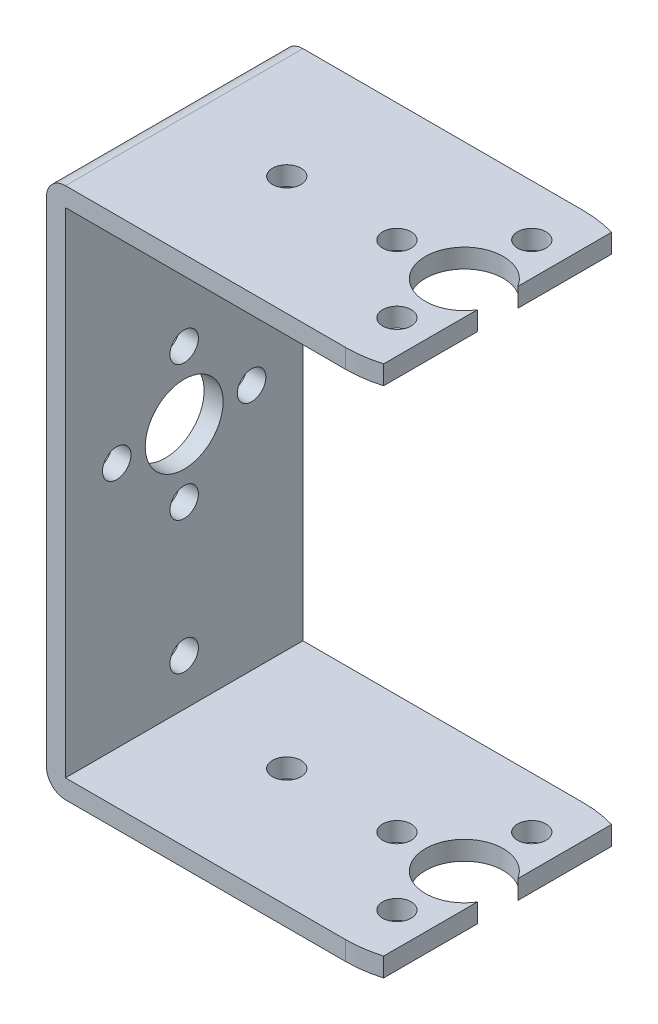
ISO-10303-21;
HEADER;
FILE_DESCRIPTION(('STEP AP214'),'2;1');
FILE_NAME('part.step','',(''),(''),'','','');
FILE_SCHEMA(('AUTOMOTIVE_DESIGN { 1 0 10303 214 1 1 1 1 }'));
ENDSEC;
DATA;
#1=APPLICATION_CONTEXT('core data for automotive mechanical design processes');
#2=APPLICATION_PROTOCOL_DEFINITION('international standard','automotive_design',2000,#1);
#3=PRODUCT_CONTEXT('',#1,'mechanical');
#4=PRODUCT('Part','Part','',(#3));
#5=PRODUCT_RELATED_PRODUCT_CATEGORY('part','',(#4));
#6=PRODUCT_DEFINITION_FORMATION('','',#4);
#7=PRODUCT_DEFINITION_CONTEXT('part definition',#1,'design');
#8=PRODUCT_DEFINITION('design','',#6,#7);
#9=PRODUCT_DEFINITION_SHAPE('','',#8);
#10=(LENGTH_UNIT() NAMED_UNIT(*) SI_UNIT(.MILLI.,.METRE.));
#11=(NAMED_UNIT(*) PLANE_ANGLE_UNIT() SI_UNIT($,.RADIAN.));
#12=(NAMED_UNIT(*) SI_UNIT($,.STERADIAN.) SOLID_ANGLE_UNIT());
#13=UNCERTAINTY_MEASURE_WITH_UNIT(LENGTH_MEASURE(1.E-05),#10,'distance_accuracy_value','');
#14=(GEOMETRIC_REPRESENTATION_CONTEXT(3) GLOBAL_UNCERTAINTY_ASSIGNED_CONTEXT((#13)) GLOBAL_UNIT_ASSIGNED_CONTEXT((#10,
#11,#12)) REPRESENTATION_CONTEXT('',''));
#15=CARTESIAN_POINT('',(0.,0.,0.));
#16=DIRECTION('',(0.,0.,1.));
#17=DIRECTION('',(1.,0.,0.));
#18=AXIS2_PLACEMENT_3D('',#15,#16,#17);
#19=CARTESIAN_POINT('',(9.5,-2.,0.));
#20=DIRECTION('',(0.,1.,0.));
#21=DIRECTION('',(0.,0.,1.));
#22=AXIS2_PLACEMENT_3D('',#19,#20,#21);
#23=CYLINDRICAL_SURFACE('',#22,12.5);
#24=DIRECTION('',(0.,1.,0.));
#25=VECTOR('',#24,1.);
#26=CARTESIAN_POINT('',(13.,-2.,12.));
#27=LINE('',#26,#25);
#28=CARTESIAN_POINT('',(13.,0.,12.));
#29=VERTEX_POINT('',#28);
#30=CARTESIAN_POINT('',(13.,-2.,12.));
#31=VERTEX_POINT('',#30);
#32=EDGE_CURVE('E371',#29,#31,#27,.F.);
#33=ORIENTED_EDGE('',*,*,#32,.F.);
#34=CARTESIAN_POINT('',(9.5,0.,0.));
#35=DIRECTION('',(0.,1.,0.));
#36=DIRECTION('',(0.,0.,1.));
#37=AXIS2_PLACEMENT_3D('',#34,#35,#36);
#38=CIRCLE('',#37,12.5);
#39=CARTESIAN_POINT('',(9.5,0.,12.5));
#40=VERTEX_POINT('',#39);
#41=EDGE_CURVE('E263',#40,#29,#38,.T.);
#42=ORIENTED_EDGE('',*,*,#41,.F.);
#43=DIRECTION('',(0.,1.,0.));
#44=VECTOR('',#43,1.);
#45=CARTESIAN_POINT('',(9.5,-2.,12.5));
#46=LINE('',#45,#44);
#47=CARTESIAN_POINT('',(9.5,-2.,12.5));
#48=VERTEX_POINT('',#47);
#49=EDGE_CURVE('E250',#48,#40,#46,.T.);
#50=ORIENTED_EDGE('',*,*,#49,.F.);
#51=CARTESIAN_POINT('',(9.5,-2.,0.));
#52=DIRECTION('',(0.,1.,0.));
#53=DIRECTION('',(0.,0.,1.));
#54=AXIS2_PLACEMENT_3D('',#51,#52,#53);
#55=CIRCLE('',#54,12.5);
#56=EDGE_CURVE('E258',#31,#48,#55,.F.);
#57=ORIENTED_EDGE('',*,*,#56,.F.);
#58=EDGE_LOOP('',(#33,#42,#50,#57));
#59=FACE_BOUND('',#58,.T.);
#60=ADVANCED_FACE('F37',(#59),#23,.T.);
#61=CARTESIAN_POINT('',(9.5,-54.,0.));
#62=DIRECTION('',(0.,-1.,0.));
#63=DIRECTION('',(0.,0.,1.));
#64=AXIS2_PLACEMENT_3D('',#61,#62,#63);
#65=CYLINDRICAL_SURFACE('',#64,12.5);
#66=DIRECTION('',(0.,-1.,0.));
#67=VECTOR('',#66,1.);
#68=CARTESIAN_POINT('',(13.,-54.,-12.));
#69=LINE('',#68,#67);
#70=CARTESIAN_POINT('',(13.,-56.,-12.));
#71=VERTEX_POINT('',#70);
#72=CARTESIAN_POINT('',(13.,-54.,-12.));
#73=VERTEX_POINT('',#72);
#74=EDGE_CURVE('E164',#71,#73,#69,.F.);
#75=ORIENTED_EDGE('',*,*,#74,.F.);
#76=CARTESIAN_POINT('',(9.5,-56.,0.));
#77=DIRECTION('',(0.,1.,0.));
#78=DIRECTION('',(0.,0.,1.));
#79=AXIS2_PLACEMENT_3D('',#76,#77,#78);
#80=CIRCLE('',#79,12.5);
#81=CARTESIAN_POINT('',(9.49999999999999,-56.,-12.5));
#82=VERTEX_POINT('',#81);
#83=EDGE_CURVE('E177',#71,#82,#80,.T.);
#84=ORIENTED_EDGE('',*,*,#83,.T.);
#85=DIRECTION('',(0.,-1.,0.));
#86=VECTOR('',#85,1.);
#87=CARTESIAN_POINT('',(9.5,-54.,-12.5));
#88=LINE('',#87,#86);
#89=CARTESIAN_POINT('',(9.49999999999999,-54.,-12.5));
#90=VERTEX_POINT('',#89);
#91=EDGE_CURVE('E314',#82,#90,#88,.F.);
#92=ORIENTED_EDGE('',*,*,#91,.T.);
#93=CARTESIAN_POINT('',(9.5,-54.,0.));
#94=DIRECTION('',(0.,1.,0.));
#95=DIRECTION('',(0.,0.,1.));
#96=AXIS2_PLACEMENT_3D('',#93,#94,#95);
#97=CIRCLE('',#96,12.5);
#98=EDGE_CURVE('E180',#90,#73,#97,.F.);
#99=ORIENTED_EDGE('',*,*,#98,.T.);
#100=EDGE_LOOP('',(#75,#84,#92,#99));
#101=FACE_BOUND('',#100,.T.);
#102=ADVANCED_FACE('F175',(#101),#65,.T.);
#103=CARTESIAN_POINT('',(-20.,-56.,-12.5));
#104=DIRECTION('',(1.,0.,0.));
#105=DIRECTION('',(0.,0.,-1.));
#106=AXIS2_PLACEMENT_3D('',#103,#104,#105);
#107=PLANE('',#106);
#108=CARTESIAN_POINT('',(-20.,-6.9,0.));
#109=DIRECTION('',(1.,0.,0.));
#110=DIRECTION('',(0.,0.,-1.));
#111=AXIS2_PLACEMENT_3D('',#108,#109,#110);
#112=CIRCLE('',#111,1.5);
#113=CARTESIAN_POINT('',(-20.,-6.9,-1.5));
#114=VERTEX_POINT('',#113);
#115=EDGE_CURVE('E377',#114,#114,#112,.F.);
#116=ORIENTED_EDGE('',*,*,#115,.T.);
#117=EDGE_LOOP('',(#116));
#118=FACE_BOUND('',#117,.T.);
#119=CARTESIAN_POINT('',(-20.,-28.,-7.1));
#120=DIRECTION('',(1.,0.,0.));
#121=DIRECTION('',(0.,0.,-1.));
#122=AXIS2_PLACEMENT_3D('',#119,#120,#121);
#123=CIRCLE('',#122,1.5);
#124=CARTESIAN_POINT('',(-20.,-28.,-8.6));
#125=VERTEX_POINT('',#124);
#126=EDGE_CURVE('E397',#125,#125,#123,.F.);
#127=ORIENTED_EDGE('',*,*,#126,.T.);
#128=EDGE_LOOP('',(#127));
#129=FACE_BOUND('',#128,.T.);
#130=CARTESIAN_POINT('',(-20.,-35.1,0.));
#131=DIRECTION('',(1.,0.,0.));
#132=DIRECTION('',(0.,0.,-1.));
#133=AXIS2_PLACEMENT_3D('',#130,#131,#132);
#134=CIRCLE('',#133,1.5);
#135=CARTESIAN_POINT('',(-20.,-35.1,-1.5));
#136=VERTEX_POINT('',#135);
#137=EDGE_CURVE('E391',#136,#136,#134,.F.);
#138=ORIENTED_EDGE('',*,*,#137,.T.);
#139=EDGE_LOOP('',(#138));
#140=FACE_BOUND('',#139,.T.);
#141=CARTESIAN_POINT('',(-20.,-28.,7.1));
#142=DIRECTION('',(1.,0.,0.));
#143=DIRECTION('',(0.,0.,-1.));
#144=AXIS2_PLACEMENT_3D('',#141,#142,#143);
#145=CIRCLE('',#144,1.5);
#146=CARTESIAN_POINT('',(-20.,-28.,5.6));
#147=VERTEX_POINT('',#146);
#148=EDGE_CURVE('E390',#147,#147,#145,.F.);
#149=ORIENTED_EDGE('',*,*,#148,.T.);
#150=EDGE_LOOP('',(#149));
#151=FACE_BOUND('',#150,.T.);
#152=CARTESIAN_POINT('',(-20.,-20.9,0.));
#153=DIRECTION('',(1.,0.,0.));
#154=DIRECTION('',(0.,0.,-1.));
#155=AXIS2_PLACEMENT_3D('',#152,#153,#154);
#156=CIRCLE('',#155,1.5);
#157=CARTESIAN_POINT('',(-20.,-20.9,-1.5));
#158=VERTEX_POINT('',#157);
#159=EDGE_CURVE('E412',#158,#158,#156,.F.);
#160=ORIENTED_EDGE('',*,*,#159,.T.);
#161=EDGE_LOOP('',(#160));
#162=FACE_BOUND('',#161,.T.);
#163=CARTESIAN_POINT('',(-20.,-49.1,0.));
#164=DIRECTION('',(1.,0.,0.));
#165=DIRECTION('',(0.,0.,-1.));
#166=AXIS2_PLACEMENT_3D('',#163,#164,#165);
#167=CIRCLE('',#166,1.5);
#168=CARTESIAN_POINT('',(-20.,-49.1,-1.5));
#169=VERTEX_POINT('',#168);
#170=EDGE_CURVE('E406',#169,#169,#167,.F.);
#171=ORIENTED_EDGE('',*,*,#170,.T.);
#172=EDGE_LOOP('',(#171));
#173=FACE_BOUND('',#172,.T.);
#174=CARTESIAN_POINT('',(-20.,-28.,0.));
#175=DIRECTION('',(1.,0.,0.));
#176=DIRECTION('',(0.,0.,-1.));
#177=AXIS2_PLACEMENT_3D('',#174,#175,#176);
#178=CIRCLE('',#177,4.1);
#179=CARTESIAN_POINT('',(-20.,-28.,-4.1));
#180=VERTEX_POINT('',#179);
#181=EDGE_CURVE('E405',#180,#180,#178,.F.);
#182=ORIENTED_EDGE('',*,*,#181,.T.);
#183=EDGE_LOOP('',(#182));
#184=FACE_BOUND('',#183,.T.);
#185=DIRECTION('',(0.,1.,0.));
#186=VECTOR('',#185,1.);
#187=CARTESIAN_POINT('',(-20.,-56.,12.5));
#188=LINE('',#187,#186);
#189=CARTESIAN_POINT('',(-20.,-54.,12.5));
#190=VERTEX_POINT('',#189);
#191=CARTESIAN_POINT('',(-20.,-2.,12.5));
#192=VERTEX_POINT('',#191);
#193=EDGE_CURVE('E228',#190,#192,#188,.T.);
#194=ORIENTED_EDGE('',*,*,#193,.F.);
#195=DIRECTION('',(0.,0.,-1.));
#196=VECTOR('',#195,1.);
#197=CARTESIAN_POINT('',(-20.,-54.,0.));
#198=LINE('',#197,#196);
#199=CARTESIAN_POINT('',(-20.,-54.,-12.5));
#200=VERTEX_POINT('',#199);
#201=EDGE_CURVE('E296',#190,#200,#198,.T.);
#202=ORIENTED_EDGE('',*,*,#201,.T.);
#203=DIRECTION('',(0.,1.,0.));
#204=VECTOR('',#203,1.);
#205=CARTESIAN_POINT('',(-20.,-56.,-12.5));
#206=LINE('',#205,#204);
#207=CARTESIAN_POINT('',(-20.,-2.,-12.5));
#208=VERTEX_POINT('',#207);
#209=EDGE_CURVE('E229',#200,#208,#206,.T.);
#210=ORIENTED_EDGE('',*,*,#209,.T.);
#211=DIRECTION('',(0.,0.,-1.));
#212=VECTOR('',#211,1.);
#213=CARTESIAN_POINT('',(-20.,-2.,0.));
#214=LINE('',#213,#212);
#215=EDGE_CURVE('E231',#192,#208,#214,.T.);
#216=ORIENTED_EDGE('',*,*,#215,.F.);
#217=EDGE_LOOP('',(#194,#202,#210,#216));
#218=FACE_BOUND('',#217,.T.);
#219=ADVANCED_FACE('F362',(#118,#129,#140,#151,#162,#173,#184,#218),#107,.T.);
#220=DIRECTION('',(0.,1.,0.));
#221=VECTOR('',#220,1.);
#222=CARTESIAN_POINT('',(13.,-2.,-12.));
#223=LINE('',#222,#221);
#224=CARTESIAN_POINT('',(13.,-2.,-12.));
#225=VERTEX_POINT('',#224);
#226=CARTESIAN_POINT('',(13.,0.,-12.));
#227=VERTEX_POINT('',#226);
#228=EDGE_CURVE('E774',#225,#227,#223,.T.);
#229=ORIENTED_EDGE('',*,*,#228,.F.);
#230=CARTESIAN_POINT('',(9.49999999999999,-2.,-12.5));
#231=VERTEX_POINT('',#230);
#232=EDGE_CURVE('E259',#231,#225,#55,.F.);
#233=ORIENTED_EDGE('',*,*,#232,.F.);
#234=DIRECTION('',(0.,1.,0.));
#235=VECTOR('',#234,1.);
#236=CARTESIAN_POINT('',(9.5,-2.,-12.5));
#237=LINE('',#236,#235);
#238=CARTESIAN_POINT('',(9.49999999999999,0.,-12.5));
#239=VERTEX_POINT('',#238);
#240=EDGE_CURVE('E255',#239,#231,#237,.F.);
#241=ORIENTED_EDGE('',*,*,#240,.F.);
#242=EDGE_CURVE('E262',#227,#239,#38,.T.);
#243=ORIENTED_EDGE('',*,*,#242,.F.);
#244=EDGE_LOOP('',(#229,#233,#241,#243));
#245=FACE_BOUND('',#244,.T.);
#246=ADVANCED_FACE('F353',(#245),#23,.T.);
#247=CARTESIAN_POINT('',(-22.,-2.,12.5));
#248=DIRECTION('',(-1.,0.,0.));
#249=DIRECTION('',(0.,0.,1.));
#250=AXIS2_PLACEMENT_3D('',#247,#248,#249);
#251=PLANE('',#250);
#252=CARTESIAN_POINT('',(-22.,-6.9,0.));
#253=DIRECTION('',(-1.,0.,0.));
#254=DIRECTION('',(0.,0.,1.));
#255=AXIS2_PLACEMENT_3D('',#252,#253,#254);
#256=CIRCLE('',#255,1.5);
#257=CARTESIAN_POINT('',(-22.,-6.9,1.5));
#258=VERTEX_POINT('',#257);
#259=EDGE_CURVE('E380',#258,#258,#256,.T.);
#260=ORIENTED_EDGE('',*,*,#259,.F.);
#261=EDGE_LOOP('',(#260));
#262=FACE_BOUND('',#261,.T.);
#263=CARTESIAN_POINT('',(-22.,-28.,-7.1));
#264=DIRECTION('',(-1.,0.,0.));
#265=DIRECTION('',(0.,0.,1.));
#266=AXIS2_PLACEMENT_3D('',#263,#264,#265);
#267=CIRCLE('',#266,1.5);
#268=CARTESIAN_POINT('',(-22.,-28.,-5.59999999999999));
#269=VERTEX_POINT('',#268);
#270=EDGE_CURVE('E394',#269,#269,#267,.T.);
#271=ORIENTED_EDGE('',*,*,#270,.F.);
#272=EDGE_LOOP('',(#271));
#273=FACE_BOUND('',#272,.T.);
#274=CARTESIAN_POINT('',(-22.,-35.1,0.));
#275=DIRECTION('',(-1.,0.,0.));
#276=DIRECTION('',(0.,0.,1.));
#277=AXIS2_PLACEMENT_3D('',#274,#275,#276);
#278=CIRCLE('',#277,1.5);
#279=CARTESIAN_POINT('',(-22.,-35.1,1.50000000000001));
#280=VERTEX_POINT('',#279);
#281=EDGE_CURVE('E387',#280,#280,#278,.T.);
#282=ORIENTED_EDGE('',*,*,#281,.F.);
#283=EDGE_LOOP('',(#282));
#284=FACE_BOUND('',#283,.T.);
#285=CARTESIAN_POINT('',(-22.,-28.,7.1));
#286=DIRECTION('',(-1.,0.,0.));
#287=DIRECTION('',(0.,0.,1.));
#288=AXIS2_PLACEMENT_3D('',#285,#286,#287);
#289=CIRCLE('',#288,1.5);
#290=CARTESIAN_POINT('',(-22.,-28.,8.6));
#291=VERTEX_POINT('',#290);
#292=EDGE_CURVE('E415',#291,#291,#289,.T.);
#293=ORIENTED_EDGE('',*,*,#292,.F.);
#294=EDGE_LOOP('',(#293));
#295=FACE_BOUND('',#294,.T.);
#296=CARTESIAN_POINT('',(-22.,-20.9,0.));
#297=DIRECTION('',(-1.,0.,0.));
#298=DIRECTION('',(0.,0.,1.));
#299=AXIS2_PLACEMENT_3D('',#296,#297,#298);
#300=CIRCLE('',#299,1.5);
#301=CARTESIAN_POINT('',(-22.,-20.9,1.5));
#302=VERTEX_POINT('',#301);
#303=EDGE_CURVE('E409',#302,#302,#300,.T.);
#304=ORIENTED_EDGE('',*,*,#303,.F.);
#305=EDGE_LOOP('',(#304));
#306=FACE_BOUND('',#305,.T.);
#307=CARTESIAN_POINT('',(-22.,-49.1,0.));
#308=DIRECTION('',(-1.,0.,0.));
#309=DIRECTION('',(0.,0.,-1.));
#310=AXIS2_PLACEMENT_3D('',#307,#308,#309);
#311=CIRCLE('',#310,1.5);
#312=CARTESIAN_POINT('',(-22.,-49.1,-1.5));
#313=VERTEX_POINT('',#312);
#314=EDGE_CURVE('E402',#313,#313,#311,.T.);
#315=ORIENTED_EDGE('',*,*,#314,.F.);
#316=EDGE_LOOP('',(#315));
#317=FACE_BOUND('',#316,.T.);
#318=CARTESIAN_POINT('',(-22.,-28.,0.));
#319=DIRECTION('',(-1.,0.,0.));
#320=DIRECTION('',(0.,0.,1.));
#321=AXIS2_PLACEMENT_3D('',#318,#319,#320);
#322=CIRCLE('',#321,4.1);
#323=CARTESIAN_POINT('',(-22.,-28.,4.1));
#324=VERTEX_POINT('',#323);
#325=EDGE_CURVE('E420',#324,#324,#322,.T.);
#326=ORIENTED_EDGE('',*,*,#325,.F.);
#327=EDGE_LOOP('',(#326));
#328=FACE_BOUND('',#327,.T.);
#329=DIRECTION('',(0.,1.,0.));
#330=VECTOR('',#329,1.);
#331=CARTESIAN_POINT('',(-22.,-2.,-12.5));
#332=LINE('',#331,#330);
#333=CARTESIAN_POINT('',(-22.,-54.,-12.5));
#334=VERTEX_POINT('',#333);
#335=CARTESIAN_POINT('',(-22.,-2.,-12.5));
#336=VERTEX_POINT('',#335);
#337=EDGE_CURVE('E247',#334,#336,#332,.T.);
#338=ORIENTED_EDGE('',*,*,#337,.F.);
#339=DIRECTION('',(0.,0.,1.));
#340=VECTOR('',#339,1.);
#341=CARTESIAN_POINT('',(-22.,-54.,12.5));
#342=LINE('',#341,#340);
#343=CARTESIAN_POINT('',(-22.,-54.,12.5));
#344=VERTEX_POINT('',#343);
#345=EDGE_CURVE('E268',#334,#344,#342,.T.);
#346=ORIENTED_EDGE('',*,*,#345,.T.);
#347=DIRECTION('',(0.,1.,0.));
#348=VECTOR('',#347,1.);
#349=CARTESIAN_POINT('',(-22.,-2.,12.5));
#350=LINE('',#349,#348);
#351=CARTESIAN_POINT('',(-22.,-2.,12.5));
#352=VERTEX_POINT('',#351);
#353=EDGE_CURVE('E243',#344,#352,#350,.T.);
#354=ORIENTED_EDGE('',*,*,#353,.T.);
#355=DIRECTION('',(0.,0.,1.));
#356=VECTOR('',#355,1.);
#357=CARTESIAN_POINT('',(-22.,-2.,12.5));
#358=LINE('',#357,#356);
#359=EDGE_CURVE('E266',#352,#336,#358,.F.);
#360=ORIENTED_EDGE('',*,*,#359,.T.);
#361=EDGE_LOOP('',(#338,#346,#354,#360));
#362=FACE_BOUND('',#361,.T.);
#363=ADVANCED_FACE('F339',(#262,#273,#284,#295,#306,#317,#328,#362),#251,.T.);
#364=CARTESIAN_POINT('',(22.,-2.,-12.5));
#365=DIRECTION('',(0.,0.,-1.));
#366=DIRECTION('',(-1.,0.,0.));
#367=AXIS2_PLACEMENT_3D('',#364,#365,#366);
#368=PLANE('',#367);
#369=DIRECTION('',(-1.,0.,0.));
#370=VECTOR('',#369,1.);
#371=CARTESIAN_POINT('',(-22.,-56.,-12.5));
#372=LINE('',#371,#370);
#373=CARTESIAN_POINT('',(-20.,-56.,-12.5));
#374=VERTEX_POINT('',#373);
#375=EDGE_CURVE('E186',#82,#374,#372,.T.);
#376=ORIENTED_EDGE('',*,*,#375,.T.);
#377=CARTESIAN_POINT('',(-20.,-54.,-12.5));
#378=DIRECTION('',(0.,0.,-1.));
#379=DIRECTION('',(-1.,0.,0.));
#380=AXIS2_PLACEMENT_3D('',#377,#378,#379);
#381=CIRCLE('',#380,2.);
#382=EDGE_CURVE('E279',#374,#334,#381,.T.);
#383=ORIENTED_EDGE('',*,*,#382,.T.);
#384=ORIENTED_EDGE('',*,*,#337,.T.);
#385=CARTESIAN_POINT('',(-20.,-2.,-12.5));
#386=DIRECTION('',(0.,0.,-1.));
#387=DIRECTION('',(-1.,0.,0.));
#388=AXIS2_PLACEMENT_3D('',#385,#386,#387);
#389=CIRCLE('',#388,2.);
#390=CARTESIAN_POINT('',(-20.,0.,-12.5));
#391=VERTEX_POINT('',#390);
#392=EDGE_CURVE('E277',#336,#391,#389,.T.);
#393=ORIENTED_EDGE('',*,*,#392,.T.);
#394=DIRECTION('',(-1.,0.,0.));
#395=VECTOR('',#394,1.);
#396=CARTESIAN_POINT('',(22.,0.,-12.5));
#397=LINE('',#396,#395);
#398=EDGE_CURVE('E240',#239,#391,#397,.T.);
#399=ORIENTED_EDGE('',*,*,#398,.F.);
#400=ORIENTED_EDGE('',*,*,#240,.T.);
#401=DIRECTION('',(-1.,0.,0.));
#402=VECTOR('',#401,1.);
#403=CARTESIAN_POINT('',(22.,-2.,-12.5));
#404=LINE('',#403,#402);
#405=EDGE_CURVE('E239',#231,#208,#404,.T.);
#406=ORIENTED_EDGE('',*,*,#405,.T.);
#407=ORIENTED_EDGE('',*,*,#209,.F.);
#408=DIRECTION('',(-1.,0.,0.));
#409=VECTOR('',#408,1.);
#410=CARTESIAN_POINT('',(22.,-54.,-12.5));
#411=LINE('',#410,#409);
#412=EDGE_CURVE('E309',#90,#200,#411,.T.);
#413=ORIENTED_EDGE('',*,*,#412,.F.);
#414=ORIENTED_EDGE('',*,*,#91,.F.);
#415=EDGE_LOOP('',(#376,#383,#384,#393,#399,#400,#406,#407,#413,#414));
#416=FACE_BOUND('',#415,.T.);
#417=ADVANCED_FACE('F336',(#416),#368,.T.);
#418=CARTESIAN_POINT('',(22.,-2.,12.5));
#419=DIRECTION('',(0.,0.,1.));
#420=DIRECTION('',(1.,0.,0.));
#421=AXIS2_PLACEMENT_3D('',#418,#419,#420);
#422=PLANE('',#421);
#423=ORIENTED_EDGE('',*,*,#353,.F.);
#424=CARTESIAN_POINT('',(-20.,-54.,12.5));
#425=DIRECTION('',(0.,0.,1.));
#426=DIRECTION('',(1.,0.,0.));
#427=AXIS2_PLACEMENT_3D('',#424,#425,#426);
#428=CIRCLE('',#427,2.);
#429=CARTESIAN_POINT('',(-20.,-56.,12.5));
#430=VERTEX_POINT('',#429);
#431=EDGE_CURVE('E273',#344,#430,#428,.T.);
#432=ORIENTED_EDGE('',*,*,#431,.T.);
#433=DIRECTION('',(1.,0.,0.));
#434=VECTOR('',#433,1.);
#435=CARTESIAN_POINT('',(-22.,-56.,12.5));
#436=LINE('',#435,#434);
#437=CARTESIAN_POINT('',(9.5,-56.,12.5));
#438=VERTEX_POINT('',#437);
#439=EDGE_CURVE('E225',#430,#438,#436,.T.);
#440=ORIENTED_EDGE('',*,*,#439,.T.);
#441=DIRECTION('',(0.,-1.,0.));
#442=VECTOR('',#441,1.);
#443=CARTESIAN_POINT('',(9.5,-54.,12.5));
#444=LINE('',#443,#442);
#445=CARTESIAN_POINT('',(9.5,-54.,12.5));
#446=VERTEX_POINT('',#445);
#447=EDGE_CURVE('E312',#446,#438,#444,.T.);
#448=ORIENTED_EDGE('',*,*,#447,.F.);
#449=DIRECTION('',(1.,0.,0.));
#450=VECTOR('',#449,1.);
#451=CARTESIAN_POINT('',(22.,-54.,12.5));
#452=LINE('',#451,#450);
#453=EDGE_CURVE('E306',#190,#446,#452,.T.);
#454=ORIENTED_EDGE('',*,*,#453,.F.);
#455=ORIENTED_EDGE('',*,*,#193,.T.);
#456=DIRECTION('',(1.,0.,0.));
#457=VECTOR('',#456,1.);
#458=CARTESIAN_POINT('',(22.,-2.,12.5));
#459=LINE('',#458,#457);
#460=EDGE_CURVE('E236',#192,#48,#459,.T.);
#461=ORIENTED_EDGE('',*,*,#460,.T.);
#462=ORIENTED_EDGE('',*,*,#49,.T.);
#463=DIRECTION('',(1.,0.,0.));
#464=VECTOR('',#463,1.);
#465=CARTESIAN_POINT('',(22.,0.,12.5));
#466=LINE('',#465,#464);
#467=CARTESIAN_POINT('',(-20.,0.,12.5));
#468=VERTEX_POINT('',#467);
#469=EDGE_CURVE('E235',#468,#40,#466,.T.);
#470=ORIENTED_EDGE('',*,*,#469,.F.);
#471=CARTESIAN_POINT('',(-20.,-2.,12.5));
#472=DIRECTION('',(0.,0.,1.));
#473=DIRECTION('',(1.,0.,0.));
#474=AXIS2_PLACEMENT_3D('',#471,#472,#473);
#475=CIRCLE('',#474,2.);
#476=EDGE_CURVE('E271',#468,#352,#475,.T.);
#477=ORIENTED_EDGE('',*,*,#476,.T.);
#478=EDGE_LOOP('',(#423,#432,#440,#448,#454,#455,#461,#462,#470,#477));
#479=FACE_BOUND('',#478,.T.);
#480=ADVANCED_FACE('F327',(#479),#422,.T.);
#481=CARTESIAN_POINT('',(0.,-2.,0.));
#482=DIRECTION('',(0.,1.,0.));
#483=DIRECTION('',(0.,0.,1.));
#484=AXIS2_PLACEMENT_3D('',#481,#482,#483);
#485=PLANE('',#484);
#486=CARTESIAN_POINT('',(-9.2,-2.,0.));
#487=DIRECTION('',(0.,1.,0.));
#488=DIRECTION('',(0.,0.,1.));
#489=AXIS2_PLACEMENT_3D('',#486,#487,#488);
#490=CIRCLE('',#489,1.5);
#491=CARTESIAN_POINT('',(-9.2,-2.,1.5));
#492=VERTEX_POINT('',#491);
#493=EDGE_CURVE('E200',#492,#492,#490,.F.);
#494=ORIENTED_EDGE('',*,*,#493,.F.);
#495=EDGE_LOOP('',(#494));
#496=FACE_BOUND('',#495,.T.);
#497=CARTESIAN_POINT('',(9.5,-2.,7.1));
#498=DIRECTION('',(0.,1.,0.));
#499=DIRECTION('',(0.,0.,1.));
#500=AXIS2_PLACEMENT_3D('',#497,#498,#499);
#501=CIRCLE('',#500,1.5);
#502=CARTESIAN_POINT('',(9.5,-2.,8.6));
#503=VERTEX_POINT('',#502);
#504=EDGE_CURVE('E199',#503,#503,#501,.F.);
#505=ORIENTED_EDGE('',*,*,#504,.F.);
#506=EDGE_LOOP('',(#505));
#507=FACE_BOUND('',#506,.T.);
#508=CARTESIAN_POINT('',(9.5,-2.,-7.1));
#509=DIRECTION('',(0.,1.,0.));
#510=DIRECTION('',(0.,0.,1.));
#511=AXIS2_PLACEMENT_3D('',#508,#509,#510);
#512=CIRCLE('',#511,1.5);
#513=CARTESIAN_POINT('',(9.5,-2.,-5.6));
#514=VERTEX_POINT('',#513);
#515=EDGE_CURVE('E212',#514,#514,#512,.F.);
#516=ORIENTED_EDGE('',*,*,#515,.F.);
#517=EDGE_LOOP('',(#516));
#518=FACE_BOUND('',#517,.T.);
#519=CARTESIAN_POINT('',(2.4,-2.,0.));
#520=DIRECTION('',(0.,1.,0.));
#521=DIRECTION('',(0.,0.,1.));
#522=AXIS2_PLACEMENT_3D('',#519,#520,#521);
#523=CIRCLE('',#522,1.5);
#524=CARTESIAN_POINT('',(2.4,-2.,1.5));
#525=VERTEX_POINT('',#524);
#526=EDGE_CURVE('E211',#525,#525,#523,.F.);
#527=ORIENTED_EDGE('',*,*,#526,.F.);
#528=EDGE_LOOP('',(#527));
#529=FACE_BOUND('',#528,.T.);
#530=ORIENTED_EDGE('',*,*,#232,.T.);
#531=DIRECTION('',(0.,0.,1.));
#532=VECTOR('',#531,1.);
#533=CARTESIAN_POINT('',(13.,-2.,0.));
#534=LINE('',#533,#532);
#535=CARTESIAN_POINT('',(13.,-2.,-2.13541565040625));
#536=VERTEX_POINT('',#535);
#537=EDGE_CURVE('E383',#225,#536,#534,.T.);
#538=ORIENTED_EDGE('',*,*,#537,.T.);
#539=CARTESIAN_POINT('',(9.5,-2.,0.));
#540=DIRECTION('',(0.,1.,0.));
#541=DIRECTION('',(0.,0.,1.));
#542=AXIS2_PLACEMENT_3D('',#539,#540,#541);
#543=CIRCLE('',#542,4.1);
#544=CARTESIAN_POINT('',(13.,-2.,2.13541565040625));
#545=VERTEX_POINT('',#544);
#546=EDGE_CURVE('E222',#545,#536,#543,.F.);
#547=ORIENTED_EDGE('',*,*,#546,.F.);
#548=EDGE_CURVE('E52',#545,#31,#534,.T.);
#549=ORIENTED_EDGE('',*,*,#548,.T.);
#550=ORIENTED_EDGE('',*,*,#56,.T.);
#551=ORIENTED_EDGE('',*,*,#460,.F.);
#552=ORIENTED_EDGE('',*,*,#215,.T.);
#553=ORIENTED_EDGE('',*,*,#405,.F.);
#554=EDGE_LOOP('',(#530,#538,#547,#549,#550,#551,#552,#553));
#555=FACE_BOUND('',#554,.T.);
#556=ADVANCED_FACE('F357',(#496,#507,#518,#529,#555),#485,.F.);
#557=CARTESIAN_POINT('',(0.,0.,0.));
#558=DIRECTION('',(0.,1.,0.));
#559=DIRECTION('',(0.,0.,1.));
#560=AXIS2_PLACEMENT_3D('',#557,#558,#559);
#561=PLANE('',#560);
#562=DIRECTION('',(0.,0.,1.));
#563=VECTOR('',#562,1.);
#564=CARTESIAN_POINT('',(13.,0.,-15.));
#565=LINE('',#564,#563);
#566=CARTESIAN_POINT('',(13.,0.,-2.13541565040625));
#567=VERTEX_POINT('',#566);
#568=EDGE_CURVE('E60',#227,#567,#565,.T.);
#569=ORIENTED_EDGE('',*,*,#568,.F.);
#570=ORIENTED_EDGE('',*,*,#242,.T.);
#571=ORIENTED_EDGE('',*,*,#398,.T.);
#572=DIRECTION('',(0.,0.,1.));
#573=VECTOR('',#572,1.);
#574=CARTESIAN_POINT('',(-20.,0.,0.));
#575=LINE('',#574,#573);
#576=EDGE_CURVE('E281',#391,#468,#575,.T.);
#577=ORIENTED_EDGE('',*,*,#576,.T.);
#578=ORIENTED_EDGE('',*,*,#469,.T.);
#579=ORIENTED_EDGE('',*,*,#41,.T.);
#580=CARTESIAN_POINT('',(13.,0.,2.13541565040625));
#581=VERTEX_POINT('',#580);
#582=EDGE_CURVE('E367',#581,#29,#565,.T.);
#583=ORIENTED_EDGE('',*,*,#582,.F.);
#584=CARTESIAN_POINT('',(9.5,0.,0.));
#585=DIRECTION('',(0.,1.,0.));
#586=DIRECTION('',(0.,0.,1.));
#587=AXIS2_PLACEMENT_3D('',#584,#585,#586);
#588=CIRCLE('',#587,4.1);
#589=EDGE_CURVE('E215',#567,#581,#588,.T.);
#590=ORIENTED_EDGE('',*,*,#589,.F.);
#591=EDGE_LOOP('',(#569,#570,#571,#577,#578,#579,#583,#590));
#592=FACE_BOUND('',#591,.T.);
#593=CARTESIAN_POINT('',(-9.2,0.,0.));
#594=DIRECTION('',(0.,1.,0.));
#595=DIRECTION('',(0.,0.,1.));
#596=AXIS2_PLACEMENT_3D('',#593,#594,#595);
#597=CIRCLE('',#596,1.5);
#598=CARTESIAN_POINT('',(-9.2,0.,1.5));
#599=VERTEX_POINT('',#598);
#600=EDGE_CURVE('E191',#599,#599,#597,.T.);
#601=ORIENTED_EDGE('',*,*,#600,.F.);
#602=EDGE_LOOP('',(#601));
#603=FACE_BOUND('',#602,.T.);
#604=CARTESIAN_POINT('',(9.5,0.,7.1));
#605=DIRECTION('',(0.,1.,0.));
#606=DIRECTION('',(0.,0.,1.));
#607=AXIS2_PLACEMENT_3D('',#604,#605,#606);
#608=CIRCLE('',#607,1.5);
#609=CARTESIAN_POINT('',(9.5,0.,8.6));
#610=VERTEX_POINT('',#609);
#611=EDGE_CURVE('E196',#610,#610,#608,.T.);
#612=ORIENTED_EDGE('',*,*,#611,.F.);
#613=EDGE_LOOP('',(#612));
#614=FACE_BOUND('',#613,.T.);
#615=CARTESIAN_POINT('',(9.5,0.,-7.1));
#616=DIRECTION('',(0.,1.,0.));
#617=DIRECTION('',(0.,0.,1.));
#618=AXIS2_PLACEMENT_3D('',#615,#616,#617);
#619=CIRCLE('',#618,1.5);
#620=CARTESIAN_POINT('',(9.5,0.,-5.6));
#621=VERTEX_POINT('',#620);
#622=EDGE_CURVE('E203',#621,#621,#619,.T.);
#623=ORIENTED_EDGE('',*,*,#622,.F.);
#624=EDGE_LOOP('',(#623));
#625=FACE_BOUND('',#624,.T.);
#626=CARTESIAN_POINT('',(2.4,0.,0.));
#627=DIRECTION('',(0.,1.,0.));
#628=DIRECTION('',(0.,0.,1.));
#629=AXIS2_PLACEMENT_3D('',#626,#627,#628);
#630=CIRCLE('',#629,1.5);
#631=CARTESIAN_POINT('',(2.4,0.,1.5));
#632=VERTEX_POINT('',#631);
#633=EDGE_CURVE('E208',#632,#632,#630,.T.);
#634=ORIENTED_EDGE('',*,*,#633,.F.);
#635=EDGE_LOOP('',(#634));
#636=FACE_BOUND('',#635,.T.);
#637=ADVANCED_FACE('F345',(#592,#603,#614,#625,#636),#561,.T.);
#638=CARTESIAN_POINT('',(0.,-56.,0.));
#639=DIRECTION('',(0.,1.,0.));
#640=DIRECTION('',(0.,0.,1.));
#641=AXIS2_PLACEMENT_3D('',#638,#639,#640);
#642=PLANE('',#641);
#643=CARTESIAN_POINT('',(-9.2,-56.,0.));
#644=DIRECTION('',(0.,1.,0.));
#645=DIRECTION('',(0.,0.,1.));
#646=AXIS2_PLACEMENT_3D('',#643,#644,#645);
#647=CIRCLE('',#646,1.5);
#648=CARTESIAN_POINT('',(-9.2,-56.,1.5));
#649=VERTEX_POINT('',#648);
#650=EDGE_CURVE('E423',#649,#649,#647,.T.);
#651=ORIENTED_EDGE('',*,*,#650,.T.);
#652=EDGE_LOOP('',(#651));
#653=FACE_BOUND('',#652,.T.);
#654=CARTESIAN_POINT('',(9.5,-56.,7.1));
#655=DIRECTION('',(0.,1.,0.));
#656=DIRECTION('',(0.,0.,1.));
#657=AXIS2_PLACEMENT_3D('',#654,#655,#656);
#658=CIRCLE('',#657,1.5);
#659=CARTESIAN_POINT('',(9.5,-56.,8.6));
#660=VERTEX_POINT('',#659);
#661=EDGE_CURVE('E426',#660,#660,#658,.T.);
#662=ORIENTED_EDGE('',*,*,#661,.T.);
#663=EDGE_LOOP('',(#662));
#664=FACE_BOUND('',#663,.T.);
#665=CARTESIAN_POINT('',(9.5,-56.,-7.1));
#666=DIRECTION('',(0.,1.,0.));
#667=DIRECTION('',(0.,0.,1.));
#668=AXIS2_PLACEMENT_3D('',#665,#666,#667);
#669=CIRCLE('',#668,1.5);
#670=CARTESIAN_POINT('',(9.5,-56.,-5.6));
#671=VERTEX_POINT('',#670);
#672=EDGE_CURVE('E433',#671,#671,#669,.T.);
#673=ORIENTED_EDGE('',*,*,#672,.T.);
#674=EDGE_LOOP('',(#673));
#675=FACE_BOUND('',#674,.T.);
#676=CARTESIAN_POINT('',(2.4,-56.,0.));
#677=DIRECTION('',(0.,1.,0.));
#678=DIRECTION('',(0.,0.,1.));
#679=AXIS2_PLACEMENT_3D('',#676,#677,#678);
#680=CIRCLE('',#679,1.5);
#681=CARTESIAN_POINT('',(2.4,-56.,1.5));
#682=VERTEX_POINT('',#681);
#683=EDGE_CURVE('E299',#682,#682,#680,.T.);
#684=ORIENTED_EDGE('',*,*,#683,.T.);
#685=EDGE_LOOP('',(#684));
#686=FACE_BOUND('',#685,.T.);
#687=ORIENTED_EDGE('',*,*,#83,.F.);
#688=DIRECTION('',(0.,0.,1.));
#689=VECTOR('',#688,1.);
#690=CARTESIAN_POINT('',(13.,-56.,-15.));
#691=LINE('',#690,#689);
#692=CARTESIAN_POINT('',(13.,-56.,-2.13541565040625));
#693=VERTEX_POINT('',#692);
#694=EDGE_CURVE('E161',#71,#693,#691,.T.);
#695=ORIENTED_EDGE('',*,*,#694,.T.);
#696=CARTESIAN_POINT('',(9.5,-56.,0.));
#697=DIRECTION('',(0.,1.,0.));
#698=DIRECTION('',(0.,0.,1.));
#699=AXIS2_PLACEMENT_3D('',#696,#697,#698);
#700=CIRCLE('',#699,4.1);
#701=CARTESIAN_POINT('',(13.,-56.,2.13541565040625));
#702=VERTEX_POINT('',#701);
#703=EDGE_CURVE('E287',#693,#702,#700,.T.);
#704=ORIENTED_EDGE('',*,*,#703,.T.);
#705=CARTESIAN_POINT('',(13.,-56.,12.));
#706=VERTEX_POINT('',#705);
#707=EDGE_CURVE('E171',#702,#706,#691,.T.);
#708=ORIENTED_EDGE('',*,*,#707,.T.);
#709=EDGE_CURVE('E188',#438,#706,#80,.T.);
#710=ORIENTED_EDGE('',*,*,#709,.F.);
#711=ORIENTED_EDGE('',*,*,#439,.F.);
#712=DIRECTION('',(0.,0.,1.));
#713=VECTOR('',#712,1.);
#714=CARTESIAN_POINT('',(-20.,-56.,-12.5));
#715=LINE('',#714,#713);
#716=EDGE_CURVE('E275',#430,#374,#715,.F.);
#717=ORIENTED_EDGE('',*,*,#716,.T.);
#718=ORIENTED_EDGE('',*,*,#375,.F.);
#719=EDGE_LOOP('',(#687,#695,#704,#708,#710,#711,#717,#718));
#720=FACE_BOUND('',#719,.T.);
#721=ADVANCED_FACE('F184',(#653,#664,#675,#686,#720),#642,.F.);
#722=CARTESIAN_POINT('',(9.5,-56.001,0.));
#723=DIRECTION('',(0.,1.,0.));
#724=DIRECTION('',(0.,0.,1.));
#725=AXIS2_PLACEMENT_3D('',#722,#723,#724);
#726=CYLINDRICAL_SURFACE('',#725,4.1);
#727=ORIENTED_EDGE('',*,*,#589,.T.);
#728=DIRECTION('',(0.,1.,0.));
#729=VECTOR('',#728,1.);
#730=CARTESIAN_POINT('',(13.,-56.001,2.13541565040625));
#731=LINE('',#730,#729);
#732=EDGE_CURVE('E372',#581,#545,#731,.F.);
#733=ORIENTED_EDGE('',*,*,#732,.T.);
#734=ORIENTED_EDGE('',*,*,#546,.T.);
#735=DIRECTION('',(0.,1.,0.));
#736=VECTOR('',#735,1.);
#737=CARTESIAN_POINT('',(13.,-56.001,-2.13541565040625));
#738=LINE('',#737,#736);
#739=EDGE_CURVE('E181',#536,#567,#738,.T.);
#740=ORIENTED_EDGE('',*,*,#739,.T.);
#741=EDGE_LOOP('',(#727,#733,#734,#740));
#742=FACE_BOUND('',#741,.T.);
#743=ADVANCED_FACE('F519',(#742),#726,.F.);
#744=CARTESIAN_POINT('',(2.4,-56.001,0.));
#745=DIRECTION('',(0.,1.,0.));
#746=DIRECTION('',(0.,0.,1.));
#747=AXIS2_PLACEMENT_3D('',#744,#745,#746);
#748=CYLINDRICAL_SURFACE('',#747,1.5);
#749=ORIENTED_EDGE('',*,*,#633,.T.);
#750=EDGE_LOOP('',(#749));
#751=FACE_BOUND('',#750,.T.);
#752=ORIENTED_EDGE('',*,*,#526,.T.);
#753=EDGE_LOOP('',(#752));
#754=FACE_BOUND('',#753,.T.);
#755=ADVANCED_FACE('F530',(#751,#754),#748,.F.);
#756=CARTESIAN_POINT('',(9.5,-56.001,-7.1));
#757=DIRECTION('',(0.,1.,0.));
#758=DIRECTION('',(0.,0.,1.));
#759=AXIS2_PLACEMENT_3D('',#756,#757,#758);
#760=CYLINDRICAL_SURFACE('',#759,1.5);
#761=ORIENTED_EDGE('',*,*,#622,.T.);
#762=EDGE_LOOP('',(#761));
#763=FACE_BOUND('',#762,.T.);
#764=ORIENTED_EDGE('',*,*,#515,.T.);
#765=EDGE_LOOP('',(#764));
#766=FACE_BOUND('',#765,.T.);
#767=ADVANCED_FACE('F540',(#763,#766),#760,.F.);
#768=CARTESIAN_POINT('',(9.5,-56.001,7.1));
#769=DIRECTION('',(0.,1.,0.));
#770=DIRECTION('',(0.,0.,1.));
#771=AXIS2_PLACEMENT_3D('',#768,#769,#770);
#772=CYLINDRICAL_SURFACE('',#771,1.5);
#773=ORIENTED_EDGE('',*,*,#611,.T.);
#774=EDGE_LOOP('',(#773));
#775=FACE_BOUND('',#774,.T.);
#776=ORIENTED_EDGE('',*,*,#504,.T.);
#777=EDGE_LOOP('',(#776));
#778=FACE_BOUND('',#777,.T.);
#779=ADVANCED_FACE('F549',(#775,#778),#772,.F.);
#780=CARTESIAN_POINT('',(-9.2,-56.001,0.));
#781=DIRECTION('',(0.,1.,0.));
#782=DIRECTION('',(0.,0.,1.));
#783=AXIS2_PLACEMENT_3D('',#780,#781,#782);
#784=CYLINDRICAL_SURFACE('',#783,1.5);
#785=ORIENTED_EDGE('',*,*,#600,.T.);
#786=EDGE_LOOP('',(#785));
#787=FACE_BOUND('',#786,.T.);
#788=ORIENTED_EDGE('',*,*,#493,.T.);
#789=EDGE_LOOP('',(#788));
#790=FACE_BOUND('',#789,.T.);
#791=ADVANCED_FACE('F558',(#787,#790),#784,.F.);
#792=DIRECTION('',(0.,-1.,0.));
#793=VECTOR('',#792,1.);
#794=CARTESIAN_POINT('',(13.,-54.,12.));
#795=LINE('',#794,#793);
#796=CARTESIAN_POINT('',(13.,-54.,12.));
#797=VERTEX_POINT('',#796);
#798=EDGE_CURVE('E320',#797,#706,#795,.T.);
#799=ORIENTED_EDGE('',*,*,#798,.F.);
#800=EDGE_CURVE('E192',#797,#446,#97,.F.);
#801=ORIENTED_EDGE('',*,*,#800,.T.);
#802=ORIENTED_EDGE('',*,*,#447,.T.);
#803=ORIENTED_EDGE('',*,*,#709,.T.);
#804=EDGE_LOOP('',(#799,#801,#802,#803));
#805=FACE_BOUND('',#804,.T.);
#806=ADVANCED_FACE('F318',(#805),#65,.T.);
#807=CARTESIAN_POINT('',(0.,-54.,0.));
#808=DIRECTION('',(0.,-1.,0.));
#809=DIRECTION('',(0.,0.,1.));
#810=AXIS2_PLACEMENT_3D('',#807,#808,#809);
#811=PLANE('',#810);
#812=CARTESIAN_POINT('',(-9.2,-54.,0.));
#813=DIRECTION('',(0.,1.,0.));
#814=DIRECTION('',(0.,0.,1.));
#815=AXIS2_PLACEMENT_3D('',#812,#813,#814);
#816=CIRCLE('',#815,1.5);
#817=CARTESIAN_POINT('',(-9.2,-54.,1.5));
#818=VERTEX_POINT('',#817);
#819=EDGE_CURVE('E430',#818,#818,#816,.F.);
#820=ORIENTED_EDGE('',*,*,#819,.T.);
#821=EDGE_LOOP('',(#820));
#822=FACE_BOUND('',#821,.T.);
#823=CARTESIAN_POINT('',(9.5,-54.,7.1));
#824=DIRECTION('',(0.,1.,0.));
#825=DIRECTION('',(0.,0.,1.));
#826=AXIS2_PLACEMENT_3D('',#823,#824,#825);
#827=CIRCLE('',#826,1.5);
#828=CARTESIAN_POINT('',(9.5,-54.,8.6));
#829=VERTEX_POINT('',#828);
#830=EDGE_CURVE('E429',#829,#829,#827,.F.);
#831=ORIENTED_EDGE('',*,*,#830,.T.);
#832=EDGE_LOOP('',(#831));
#833=FACE_BOUND('',#832,.T.);
#834=CARTESIAN_POINT('',(9.5,-54.,-7.1));
#835=DIRECTION('',(0.,1.,0.));
#836=DIRECTION('',(0.,0.,1.));
#837=AXIS2_PLACEMENT_3D('',#834,#835,#836);
#838=CIRCLE('',#837,1.5);
#839=CARTESIAN_POINT('',(9.5,-54.,-5.6));
#840=VERTEX_POINT('',#839);
#841=EDGE_CURVE('E302',#840,#840,#838,.F.);
#842=ORIENTED_EDGE('',*,*,#841,.T.);
#843=EDGE_LOOP('',(#842));
#844=FACE_BOUND('',#843,.T.);
#845=CARTESIAN_POINT('',(2.4,-54.,0.));
#846=DIRECTION('',(0.,1.,0.));
#847=DIRECTION('',(0.,0.,1.));
#848=AXIS2_PLACEMENT_3D('',#845,#846,#847);
#849=CIRCLE('',#848,1.5);
#850=CARTESIAN_POINT('',(2.4,-54.,1.5));
#851=VERTEX_POINT('',#850);
#852=EDGE_CURVE('E294',#851,#851,#849,.F.);
#853=ORIENTED_EDGE('',*,*,#852,.T.);
#854=EDGE_LOOP('',(#853));
#855=FACE_BOUND('',#854,.T.);
#856=ORIENTED_EDGE('',*,*,#800,.F.);
#857=DIRECTION('',(0.,0.,-1.));
#858=VECTOR('',#857,1.);
#859=CARTESIAN_POINT('',(13.,-54.,0.));
#860=LINE('',#859,#858);
#861=CARTESIAN_POINT('',(13.,-54.,2.13541565040625));
#862=VERTEX_POINT('',#861);
#863=EDGE_CURVE('E170',#797,#862,#860,.T.);
#864=ORIENTED_EDGE('',*,*,#863,.T.);
#865=CARTESIAN_POINT('',(9.5,-54.,0.));
#866=DIRECTION('',(0.,1.,0.));
#867=DIRECTION('',(0.,0.,1.));
#868=AXIS2_PLACEMENT_3D('',#865,#866,#867);
#869=CIRCLE('',#868,4.1);
#870=CARTESIAN_POINT('',(13.,-54.,-2.13541565040625));
#871=VERTEX_POINT('',#870);
#872=EDGE_CURVE('E289',#862,#871,#869,.F.);
#873=ORIENTED_EDGE('',*,*,#872,.T.);
#874=EDGE_CURVE('E182',#871,#73,#860,.T.);
#875=ORIENTED_EDGE('',*,*,#874,.T.);
#876=ORIENTED_EDGE('',*,*,#98,.F.);
#877=ORIENTED_EDGE('',*,*,#412,.T.);
#878=ORIENTED_EDGE('',*,*,#201,.F.);
#879=ORIENTED_EDGE('',*,*,#453,.T.);
#880=EDGE_LOOP('',(#856,#864,#873,#875,#876,#877,#878,#879));
#881=FACE_BOUND('',#880,.T.);
#882=ADVANCED_FACE('F324',(#822,#833,#844,#855,#881),#811,.F.);
#883=CARTESIAN_POINT('',(9.5,0.001000000000001,0.));
#884=DIRECTION('',(0.,-1.,0.));
#885=DIRECTION('',(0.,0.,1.));
#886=AXIS2_PLACEMENT_3D('',#883,#884,#885);
#887=CYLINDRICAL_SURFACE('',#886,4.1);
#888=ORIENTED_EDGE('',*,*,#703,.F.);
#889=DIRECTION('',(0.,-1.,0.));
#890=VECTOR('',#889,1.);
#891=CARTESIAN_POINT('',(13.,0.001000000000001,-2.13541565040625));
#892=LINE('',#891,#890);
#893=EDGE_CURVE('E11',#693,#871,#892,.F.);
#894=ORIENTED_EDGE('',*,*,#893,.T.);
#895=ORIENTED_EDGE('',*,*,#872,.F.);
#896=DIRECTION('',(0.,-1.,0.));
#897=VECTOR('',#896,1.);
#898=CARTESIAN_POINT('',(13.,0.001000000000001,2.13541565040625));
#899=LINE('',#898,#897);
#900=EDGE_CURVE('E45',#862,#702,#899,.T.);
#901=ORIENTED_EDGE('',*,*,#900,.T.);
#902=EDGE_LOOP('',(#888,#894,#895,#901));
#903=FACE_BOUND('',#902,.T.);
#904=ADVANCED_FACE('F286',(#903),#887,.F.);
#905=CARTESIAN_POINT('',(2.4,0.001000000000001,0.));
#906=DIRECTION('',(0.,-1.,0.));
#907=DIRECTION('',(0.,0.,1.));
#908=AXIS2_PLACEMENT_3D('',#905,#906,#907);
#909=CYLINDRICAL_SURFACE('',#908,1.5);
#910=ORIENTED_EDGE('',*,*,#683,.F.);
#911=EDGE_LOOP('',(#910));
#912=FACE_BOUND('',#911,.T.);
#913=ORIENTED_EDGE('',*,*,#852,.F.);
#914=EDGE_LOOP('',(#913));
#915=FACE_BOUND('',#914,.T.);
#916=ADVANCED_FACE('F450',(#912,#915),#909,.F.);
#917=CARTESIAN_POINT('',(9.5,0.001000000000001,-7.1));
#918=DIRECTION('',(0.,-1.,0.));
#919=DIRECTION('',(0.,0.,1.));
#920=AXIS2_PLACEMENT_3D('',#917,#918,#919);
#921=CYLINDRICAL_SURFACE('',#920,1.5);
#922=ORIENTED_EDGE('',*,*,#672,.F.);
#923=EDGE_LOOP('',(#922));
#924=FACE_BOUND('',#923,.T.);
#925=ORIENTED_EDGE('',*,*,#841,.F.);
#926=EDGE_LOOP('',(#925));
#927=FACE_BOUND('',#926,.T.);
#928=ADVANCED_FACE('F447',(#924,#927),#921,.F.);
#929=CARTESIAN_POINT('',(9.5,0.001000000000001,7.1));
#930=DIRECTION('',(0.,-1.,0.));
#931=DIRECTION('',(0.,0.,1.));
#932=AXIS2_PLACEMENT_3D('',#929,#930,#931);
#933=CYLINDRICAL_SURFACE('',#932,1.5);
#934=ORIENTED_EDGE('',*,*,#661,.F.);
#935=EDGE_LOOP('',(#934));
#936=FACE_BOUND('',#935,.T.);
#937=ORIENTED_EDGE('',*,*,#830,.F.);
#938=EDGE_LOOP('',(#937));
#939=FACE_BOUND('',#938,.T.);
#940=ADVANCED_FACE('F449',(#936,#939),#933,.F.);
#941=CARTESIAN_POINT('',(-9.2,0.001000000000001,0.));
#942=DIRECTION('',(0.,-1.,0.));
#943=DIRECTION('',(0.,0.,1.));
#944=AXIS2_PLACEMENT_3D('',#941,#942,#943);
#945=CYLINDRICAL_SURFACE('',#944,1.5);
#946=ORIENTED_EDGE('',*,*,#650,.F.);
#947=EDGE_LOOP('',(#946));
#948=FACE_BOUND('',#947,.T.);
#949=ORIENTED_EDGE('',*,*,#819,.F.);
#950=EDGE_LOOP('',(#949));
#951=FACE_BOUND('',#950,.T.);
#952=ADVANCED_FACE('F457',(#948,#951),#945,.F.);
#953=CARTESIAN_POINT('',(22.001,-28.,0.));
#954=DIRECTION('',(-1.,0.,0.));
#955=DIRECTION('',(0.,0.,1.));
#956=AXIS2_PLACEMENT_3D('',#953,#954,#955);
#957=CYLINDRICAL_SURFACE('',#956,4.1);
#958=ORIENTED_EDGE('',*,*,#181,.F.);
#959=EDGE_LOOP('',(#958));
#960=FACE_BOUND('',#959,.T.);
#961=ORIENTED_EDGE('',*,*,#325,.T.);
#962=EDGE_LOOP('',(#961));
#963=FACE_BOUND('',#962,.T.);
#964=ADVANCED_FACE('F614',(#960,#963),#957,.F.);
#965=CARTESIAN_POINT('',(22.001,-49.1,0.));
#966=DIRECTION('',(-1.,0.,0.));
#967=DIRECTION('',(0.,0.,1.));
#968=AXIS2_PLACEMENT_3D('',#965,#966,#967);
#969=CYLINDRICAL_SURFACE('',#968,1.5);
#970=ORIENTED_EDGE('',*,*,#170,.F.);
#971=EDGE_LOOP('',(#970));
#972=FACE_BOUND('',#971,.T.);
#973=ORIENTED_EDGE('',*,*,#314,.T.);
#974=EDGE_LOOP('',(#973));
#975=FACE_BOUND('',#974,.T.);
#976=ADVANCED_FACE('F630',(#972,#975),#969,.F.);
#977=CARTESIAN_POINT('',(22.001,-20.9,0.));
#978=DIRECTION('',(-1.,0.,0.));
#979=DIRECTION('',(0.,0.,1.));
#980=AXIS2_PLACEMENT_3D('',#977,#978,#979);
#981=CYLINDRICAL_SURFACE('',#980,1.5);
#982=ORIENTED_EDGE('',*,*,#159,.F.);
#983=EDGE_LOOP('',(#982));
#984=FACE_BOUND('',#983,.T.);
#985=ORIENTED_EDGE('',*,*,#303,.T.);
#986=EDGE_LOOP('',(#985));
#987=FACE_BOUND('',#986,.T.);
#988=ADVANCED_FACE('F640',(#984,#987),#981,.F.);
#989=CARTESIAN_POINT('',(22.001,-28.,7.1));
#990=DIRECTION('',(-1.,0.,0.));
#991=DIRECTION('',(0.,0.,1.));
#992=AXIS2_PLACEMENT_3D('',#989,#990,#991);
#993=CYLINDRICAL_SURFACE('',#992,1.5);
#994=ORIENTED_EDGE('',*,*,#148,.F.);
#995=EDGE_LOOP('',(#994));
#996=FACE_BOUND('',#995,.T.);
#997=ORIENTED_EDGE('',*,*,#292,.T.);
#998=EDGE_LOOP('',(#997));
#999=FACE_BOUND('',#998,.T.);
#1000=ADVANCED_FACE('F650',(#996,#999),#993,.F.);
#1001=CARTESIAN_POINT('',(22.001,-35.1,0.));
#1002=DIRECTION('',(-1.,0.,0.));
#1003=DIRECTION('',(0.,0.,1.));
#1004=AXIS2_PLACEMENT_3D('',#1001,#1002,#1003);
#1005=CYLINDRICAL_SURFACE('',#1004,1.5);
#1006=ORIENTED_EDGE('',*,*,#137,.F.);
#1007=EDGE_LOOP('',(#1006));
#1008=FACE_BOUND('',#1007,.T.);
#1009=ORIENTED_EDGE('',*,*,#281,.T.);
#1010=EDGE_LOOP('',(#1009));
#1011=FACE_BOUND('',#1010,.T.);
#1012=ADVANCED_FACE('F660',(#1008,#1011),#1005,.F.);
#1013=CARTESIAN_POINT('',(22.001,-28.,-7.1));
#1014=DIRECTION('',(-1.,0.,0.));
#1015=DIRECTION('',(0.,0.,1.));
#1016=AXIS2_PLACEMENT_3D('',#1013,#1014,#1015);
#1017=CYLINDRICAL_SURFACE('',#1016,1.5);
#1018=ORIENTED_EDGE('',*,*,#126,.F.);
#1019=EDGE_LOOP('',(#1018));
#1020=FACE_BOUND('',#1019,.T.);
#1021=ORIENTED_EDGE('',*,*,#270,.T.);
#1022=EDGE_LOOP('',(#1021));
#1023=FACE_BOUND('',#1022,.T.);
#1024=ADVANCED_FACE('F670',(#1020,#1023),#1017,.F.);
#1025=CARTESIAN_POINT('',(22.001,-6.9,0.));
#1026=DIRECTION('',(-1.,0.,0.));
#1027=DIRECTION('',(0.,0.,1.));
#1028=AXIS2_PLACEMENT_3D('',#1025,#1026,#1027);
#1029=CYLINDRICAL_SURFACE('',#1028,1.5);
#1030=ORIENTED_EDGE('',*,*,#115,.F.);
#1031=EDGE_LOOP('',(#1030));
#1032=FACE_BOUND('',#1031,.T.);
#1033=ORIENTED_EDGE('',*,*,#259,.T.);
#1034=EDGE_LOOP('',(#1033));
#1035=FACE_BOUND('',#1034,.T.);
#1036=ADVANCED_FACE('F680',(#1032,#1035),#1029,.F.);
#1037=CARTESIAN_POINT('',(-20.,-54.,12.5));
#1038=DIRECTION('',(0.,0.,-1.));
#1039=DIRECTION('',(-1.,0.,0.));
#1040=AXIS2_PLACEMENT_3D('',#1037,#1038,#1039);
#1041=CYLINDRICAL_SURFACE('',#1040,2.);
#1042=ORIENTED_EDGE('',*,*,#382,.F.);
#1043=ORIENTED_EDGE('',*,*,#716,.F.);
#1044=ORIENTED_EDGE('',*,*,#431,.F.);
#1045=ORIENTED_EDGE('',*,*,#345,.F.);
#1046=EDGE_LOOP('',(#1042,#1043,#1044,#1045));
#1047=FACE_BOUND('',#1046,.T.);
#1048=ADVANCED_FACE('F332',(#1047),#1041,.T.);
#1049=CARTESIAN_POINT('',(-20.,-2.,0.));
#1050=DIRECTION('',(0.,0.,1.));
#1051=DIRECTION('',(1.,0.,0.));
#1052=AXIS2_PLACEMENT_3D('',#1049,#1050,#1051);
#1053=CYLINDRICAL_SURFACE('',#1052,2.);
#1054=ORIENTED_EDGE('',*,*,#392,.F.);
#1055=ORIENTED_EDGE('',*,*,#359,.F.);
#1056=ORIENTED_EDGE('',*,*,#476,.F.);
#1057=ORIENTED_EDGE('',*,*,#576,.F.);
#1058=EDGE_LOOP('',(#1054,#1055,#1056,#1057));
#1059=FACE_BOUND('',#1058,.T.);
#1060=ADVANCED_FACE('F39',(#1059),#1053,.T.);
#1061=CARTESIAN_POINT('',(13.,-56.,-15.));
#1062=DIRECTION('',(-1.,0.,0.));
#1063=DIRECTION('',(0.,0.,1.));
#1064=AXIS2_PLACEMENT_3D('',#1061,#1062,#1063);
#1065=PLANE('',#1064);
#1066=ORIENTED_EDGE('',*,*,#798,.T.);
#1067=ORIENTED_EDGE('',*,*,#707,.F.);
#1068=ORIENTED_EDGE('',*,*,#900,.F.);
#1069=ORIENTED_EDGE('',*,*,#863,.F.);
#1070=EDGE_LOOP('',(#1066,#1067,#1068,#1069));
#1071=FACE_BOUND('',#1070,.T.);
#1072=ADVANCED_FACE('F366',(#1071),#1065,.F.);
#1073=ORIENTED_EDGE('',*,*,#74,.T.);
#1074=ORIENTED_EDGE('',*,*,#874,.F.);
#1075=ORIENTED_EDGE('',*,*,#893,.F.);
#1076=ORIENTED_EDGE('',*,*,#694,.F.);
#1077=EDGE_LOOP('',(#1073,#1074,#1075,#1076));
#1078=FACE_BOUND('',#1077,.T.);
#1079=ADVANCED_FACE('F163',(#1078),#1065,.F.);
#1080=ORIENTED_EDGE('',*,*,#228,.T.);
#1081=ORIENTED_EDGE('',*,*,#568,.T.);
#1082=ORIENTED_EDGE('',*,*,#739,.F.);
#1083=ORIENTED_EDGE('',*,*,#537,.F.);
#1084=EDGE_LOOP('',(#1080,#1081,#1082,#1083));
#1085=FACE_BOUND('',#1084,.T.);
#1086=ADVANCED_FACE('F754',(#1085),#1065,.F.);
#1087=ORIENTED_EDGE('',*,*,#32,.T.);
#1088=ORIENTED_EDGE('',*,*,#548,.F.);
#1089=ORIENTED_EDGE('',*,*,#732,.F.);
#1090=ORIENTED_EDGE('',*,*,#582,.T.);
#1091=EDGE_LOOP('',(#1087,#1088,#1089,#1090));
#1092=FACE_BOUND('',#1091,.T.);
#1093=ADVANCED_FACE('F370',(#1092),#1065,.F.);
#1094=CLOSED_SHELL('',(#60,#102,#219,#246,#363,#417,#480,#556,#637,#721,#743,#755,#767,#779,
#791,#806,#882,#904,#916,#928,#940,#952,#964,#976,#988,#1000,#1012,#1024,#1036,#1048,#1060,
#1072,#1079,#1086,#1093));
#1095=MANIFOLD_SOLID_BREP('B2',#1094);
#1096=ADVANCED_BREP_SHAPE_REPRESENTATION('',(#18,#1095),#14);
#1097=SHAPE_DEFINITION_REPRESENTATION(#9,#1096);
ENDSEC;
END-ISO-10303-21;
